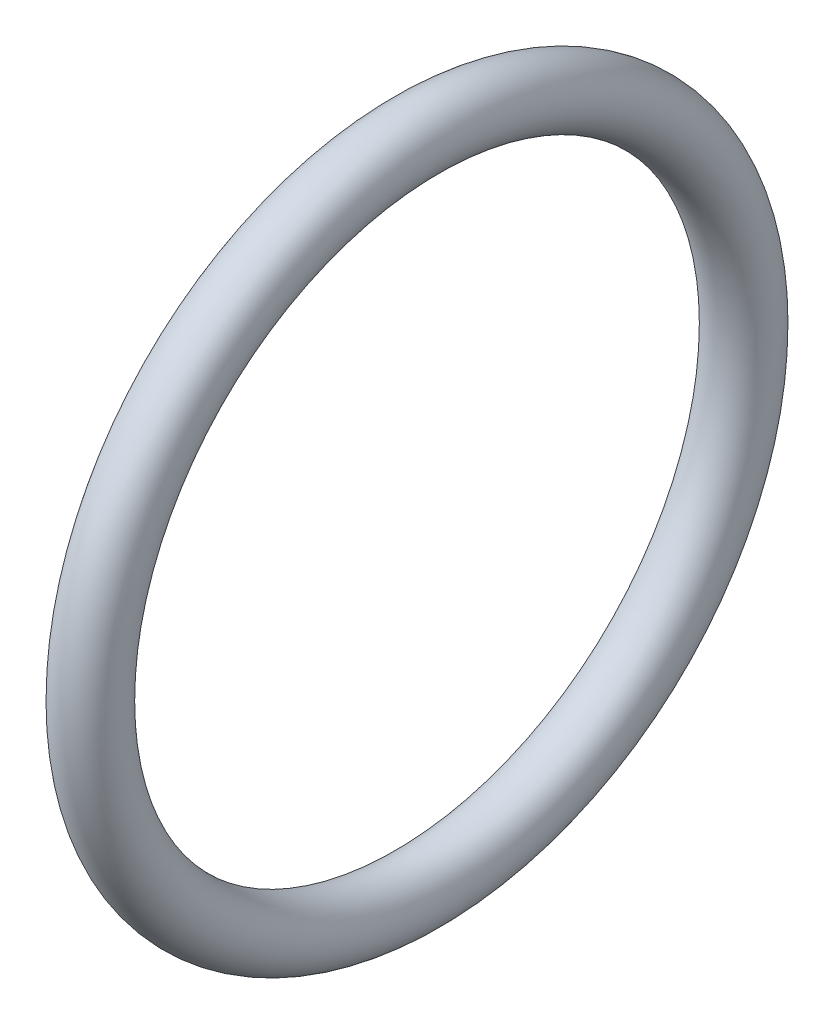
ISO-10303-21;
HEADER;
FILE_DESCRIPTION(('STEP AP214'),'2;1');
FILE_NAME('part.step','',(''),(''),'','','');
FILE_SCHEMA(('AUTOMOTIVE_DESIGN { 1 0 10303 214 1 1 1 1 }'));
ENDSEC;
DATA;
#1=APPLICATION_CONTEXT('core data for automotive mechanical design processes');
#2=APPLICATION_PROTOCOL_DEFINITION('international standard','automotive_design',2000,#1);
#3=PRODUCT_CONTEXT('',#1,'mechanical');
#4=PRODUCT('Part','Part','',(#3));
#5=PRODUCT_RELATED_PRODUCT_CATEGORY('part','',(#4));
#6=PRODUCT_DEFINITION_FORMATION('','',#4);
#7=PRODUCT_DEFINITION_CONTEXT('part definition',#1,'design');
#8=PRODUCT_DEFINITION('design','',#6,#7);
#9=PRODUCT_DEFINITION_SHAPE('','',#8);
#10=(LENGTH_UNIT() NAMED_UNIT(*) SI_UNIT(.MILLI.,.METRE.));
#11=(NAMED_UNIT(*) PLANE_ANGLE_UNIT() SI_UNIT($,.RADIAN.));
#12=(NAMED_UNIT(*) SI_UNIT($,.STERADIAN.) SOLID_ANGLE_UNIT());
#13=UNCERTAINTY_MEASURE_WITH_UNIT(LENGTH_MEASURE(1.E-05),#10,'distance_accuracy_value','');
#14=(GEOMETRIC_REPRESENTATION_CONTEXT(3) GLOBAL_UNCERTAINTY_ASSIGNED_CONTEXT((#13)) GLOBAL_UNIT_ASSIGNED_CONTEXT((#10,
#11,#12)) REPRESENTATION_CONTEXT('',''));
#15=CARTESIAN_POINT('',(0.,0.,0.));
#16=DIRECTION('',(0.,0.,1.));
#17=DIRECTION('',(1.,0.,0.));
#18=AXIS2_PLACEMENT_3D('',#15,#16,#17);
#19=CARTESIAN_POINT('',(1.69863618752621,0.,0.));
#20=DIRECTION('',(-1.,0.,0.));
#21=DIRECTION('',(0.,0.,1.));
#22=AXIS2_PLACEMENT_3D('',#19,#20,#21);
#23=TOROIDAL_SURFACE('',#22,26.0414518843274,2.5);
#24=CARTESIAN_POINT('',(1.69863618752621,0.,28.5414518843274));
#25=VERTEX_POINT('',#24);
#26=VERTEX_LOOP('',#25);
#27=FACE_BOUND('',#26,.T.);
#28=ADVANCED_FACE('F33',(#27),#23,.T.);
#29=CLOSED_SHELL('',(#28));
#30=MANIFOLD_SOLID_BREP('B2',#29);
#31=ADVANCED_BREP_SHAPE_REPRESENTATION('',(#18,#30),#14);
#32=SHAPE_DEFINITION_REPRESENTATION(#9,#31);
ENDSEC;
END-ISO-10303-21;
